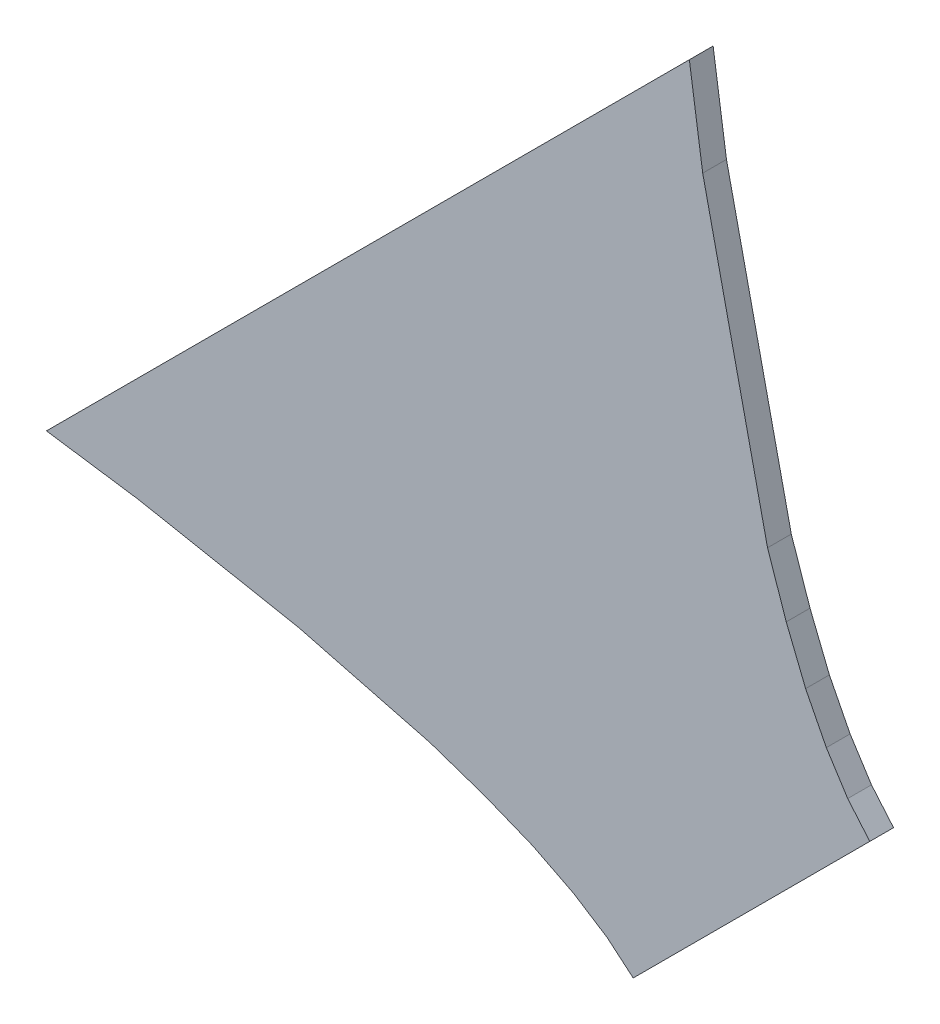
ISO-10303-21;
HEADER;
FILE_DESCRIPTION(('STEP AP214'),'2;1');
FILE_NAME('part.step','',(''),(''),'','','');
FILE_SCHEMA(('AUTOMOTIVE_DESIGN { 1 0 10303 214 1 1 1 1 }'));
ENDSEC;
DATA;
#1=APPLICATION_CONTEXT('core data for automotive mechanical design processes');
#2=APPLICATION_PROTOCOL_DEFINITION('international standard','automotive_design',2000,#1);
#3=PRODUCT_CONTEXT('',#1,'mechanical');
#4=PRODUCT('Part','Part','',(#3));
#5=PRODUCT_RELATED_PRODUCT_CATEGORY('part','',(#4));
#6=PRODUCT_DEFINITION_FORMATION('','',#4);
#7=PRODUCT_DEFINITION_CONTEXT('part definition',#1,'design');
#8=PRODUCT_DEFINITION('design','',#6,#7);
#9=PRODUCT_DEFINITION_SHAPE('','',#8);
#10=(LENGTH_UNIT() NAMED_UNIT(*) SI_UNIT(.MILLI.,.METRE.));
#11=(NAMED_UNIT(*) PLANE_ANGLE_UNIT() SI_UNIT($,.RADIAN.));
#12=(NAMED_UNIT(*) SI_UNIT($,.STERADIAN.) SOLID_ANGLE_UNIT());
#13=UNCERTAINTY_MEASURE_WITH_UNIT(LENGTH_MEASURE(1.E-05),#10,'distance_accuracy_value','');
#14=(GEOMETRIC_REPRESENTATION_CONTEXT(3) GLOBAL_UNCERTAINTY_ASSIGNED_CONTEXT((#13)) GLOBAL_UNIT_ASSIGNED_CONTEXT((#10,
#11,#12)) REPRESENTATION_CONTEXT('',''));
#15=CARTESIAN_POINT('',(0.,0.,0.));
#16=DIRECTION('',(0.,0.,1.));
#17=DIRECTION('',(1.,0.,0.));
#18=AXIS2_PLACEMENT_3D('',#15,#16,#17);
#19=CARTESIAN_POINT('',(75.5120010375977,89.8219985961914,0.));
#20=DIRECTION('',(-0.763352299873124,-0.645982404000613,0.));
#21=DIRECTION('',(-0.645982404000613,0.763352299873124,0.));
#22=AXIS2_PLACEMENT_3D('',#19,#20,#21);
#23=PLANE('',#22);
#24=DIRECTION('',(-0.645982404000613,0.763352299873124,0.));
#25=VECTOR('',#24,1.);
#26=CARTESIAN_POINT('',(75.5120010375977,89.8219985961914,0.03556));
#27=LINE('',#26,#25);
#28=CARTESIAN_POINT('',(75.5120010375977,89.8219985961914,0.03556));
#29=VERTEX_POINT('',#28);
#30=CARTESIAN_POINT('',(75.4789962768555,89.8610000610352,0.03556));
#31=VERTEX_POINT('',#30);
#32=EDGE_CURVE('E11',#29,#31,#27,.T.);
#33=ORIENTED_EDGE('',*,*,#32,.F.);
#34=DIRECTION('',(0.,0.,1.));
#35=VECTOR('',#34,1.);
#36=CARTESIAN_POINT('',(75.5120010375977,89.8219985961914,0.));
#37=LINE('',#36,#35);
#38=CARTESIAN_POINT('',(75.5120010375977,89.8219985961914,0.));
#39=VERTEX_POINT('',#38);
#40=EDGE_CURVE('E24',#39,#29,#37,.T.);
#41=ORIENTED_EDGE('',*,*,#40,.F.);
#42=DIRECTION('',(-0.645982404000613,0.763352299873124,0.));
#43=VECTOR('',#42,1.);
#44=CARTESIAN_POINT('',(75.5120010375977,89.8219985961914,0.));
#45=LINE('',#44,#43);
#46=CARTESIAN_POINT('',(75.4789962768555,89.8610000610352,0.));
#47=VERTEX_POINT('',#46);
#48=EDGE_CURVE('E154',#39,#47,#45,.T.);
#49=ORIENTED_EDGE('',*,*,#48,.T.);
#50=DIRECTION('',(0.,0.,1.));
#51=VECTOR('',#50,1.);
#52=CARTESIAN_POINT('',(75.4789962768555,89.8610000610352,0.));
#53=LINE('',#52,#51);
#54=EDGE_CURVE('E37',#47,#31,#53,.T.);
#55=ORIENTED_EDGE('',*,*,#54,.T.);
#56=EDGE_LOOP('',(#33,#41,#49,#55));
#57=FACE_BOUND('',#56,.T.);
#58=ADVANCED_FACE('F17',(#57),#23,.F.);
#59=CARTESIAN_POINT('',(75.4789962768555,89.8610000610352,0.));
#60=DIRECTION('',(-0.842304075541954,-0.539002638514335,0.));
#61=DIRECTION('',(-0.539002638514335,0.842304075541954,0.));
#62=AXIS2_PLACEMENT_3D('',#59,#60,#61);
#63=PLANE('',#62);
#64=DIRECTION('',(-0.539002638514335,0.842304075541954,0.));
#65=VECTOR('',#64,1.);
#66=CARTESIAN_POINT('',(75.4789962768555,89.8610000610352,0.03556));
#67=LINE('',#66,#65);
#68=CARTESIAN_POINT('',(75.4469985961914,89.911003112793,0.03556));
#69=VERTEX_POINT('',#68);
#70=EDGE_CURVE('E266',#31,#69,#67,.T.);
#71=ORIENTED_EDGE('',*,*,#70,.F.);
#72=ORIENTED_EDGE('',*,*,#54,.F.);
#73=DIRECTION('',(-0.539002638514335,0.842304075541954,0.));
#74=VECTOR('',#73,1.);
#75=CARTESIAN_POINT('',(75.4789962768555,89.8610000610352,0.));
#76=LINE('',#75,#74);
#77=CARTESIAN_POINT('',(75.4469985961914,89.911003112793,0.));
#78=VERTEX_POINT('',#77);
#79=EDGE_CURVE('E263',#47,#78,#76,.T.);
#80=ORIENTED_EDGE('',*,*,#79,.T.);
#81=DIRECTION('',(0.,0.,1.));
#82=VECTOR('',#81,1.);
#83=CARTESIAN_POINT('',(75.4469985961914,89.911003112793,0.));
#84=LINE('',#83,#82);
#85=EDGE_CURVE('E261',#78,#69,#84,.T.);
#86=ORIENTED_EDGE('',*,*,#85,.T.);
#87=EDGE_LOOP('',(#71,#72,#80,#86));
#88=FACE_BOUND('',#87,.T.);
#89=ADVANCED_FACE('F274',(#88),#63,.F.);
#90=CARTESIAN_POINT('',(75.4469985961914,89.911003112793,0.));
#91=DIRECTION('',(-0.891486661595891,-0.453046942597137,0.));
#92=DIRECTION('',(-0.453046942597137,0.891486661595891,0.));
#93=AXIS2_PLACEMENT_3D('',#90,#91,#92);
#94=PLANE('',#93);
#95=DIRECTION('',(-0.453046942597137,0.891486661595891,0.));
#96=VECTOR('',#95,1.);
#97=CARTESIAN_POINT('',(75.4469985961914,89.911003112793,0.03556));
#98=LINE('',#97,#96);
#99=CARTESIAN_POINT('',(75.4160003662109,89.9720001220703,0.03556));
#100=VERTEX_POINT('',#99);
#101=EDGE_CURVE('E258',#69,#100,#98,.T.);
#102=ORIENTED_EDGE('',*,*,#101,.F.);
#103=ORIENTED_EDGE('',*,*,#85,.F.);
#104=DIRECTION('',(-0.453046942597137,0.891486661595891,0.));
#105=VECTOR('',#104,1.);
#106=CARTESIAN_POINT('',(75.4469985961914,89.911003112793,0.));
#107=LINE('',#106,#105);
#108=CARTESIAN_POINT('',(75.4160003662109,89.9720001220703,0.));
#109=VERTEX_POINT('',#108);
#110=EDGE_CURVE('E255',#78,#109,#107,.T.);
#111=ORIENTED_EDGE('',*,*,#110,.T.);
#112=DIRECTION('',(0.,0.,1.));
#113=VECTOR('',#112,1.);
#114=CARTESIAN_POINT('',(75.4160003662109,89.9720001220703,0.));
#115=LINE('',#114,#113);
#116=EDGE_CURVE('E253',#109,#100,#115,.T.);
#117=ORIENTED_EDGE('',*,*,#116,.T.);
#118=EDGE_LOOP('',(#102,#103,#111,#117));
#119=FACE_BOUND('',#118,.T.);
#120=ADVANCED_FACE('F280',(#119),#94,.F.);
#121=CARTESIAN_POINT('',(75.4160003662109,89.9720001220703,0.));
#122=DIRECTION('',(-0.927586015125425,-0.373609668696804,0.));
#123=DIRECTION('',(-0.373609668696804,0.927586015125425,0.));
#124=AXIS2_PLACEMENT_3D('',#121,#122,#123);
#125=PLANE('',#124);
#126=DIRECTION('',(-0.373609668696804,0.927586015125425,0.));
#127=VECTOR('',#126,1.);
#128=CARTESIAN_POINT('',(75.4160003662109,89.9720001220703,0.03556));
#129=LINE('',#128,#127);
#130=CARTESIAN_POINT('',(75.3870010375977,90.0439987182617,0.03556));
#131=VERTEX_POINT('',#130);
#132=EDGE_CURVE('E250',#100,#131,#129,.T.);
#133=ORIENTED_EDGE('',*,*,#132,.F.);
#134=ORIENTED_EDGE('',*,*,#116,.F.);
#135=DIRECTION('',(-0.373609668696804,0.927586015125425,0.));
#136=VECTOR('',#135,1.);
#137=CARTESIAN_POINT('',(75.4160003662109,89.9720001220703,0.));
#138=LINE('',#137,#136);
#139=CARTESIAN_POINT('',(75.3870010375977,90.0439987182617,0.));
#140=VERTEX_POINT('',#139);
#141=EDGE_CURVE('E247',#109,#140,#138,.T.);
#142=ORIENTED_EDGE('',*,*,#141,.T.);
#143=DIRECTION('',(0.,0.,1.));
#144=VECTOR('',#143,1.);
#145=CARTESIAN_POINT('',(75.3870010375977,90.0439987182617,0.));
#146=LINE('',#145,#144);
#147=EDGE_CURVE('E245',#140,#131,#146,.T.);
#148=ORIENTED_EDGE('',*,*,#147,.T.);
#149=EDGE_LOOP('',(#133,#134,#142,#148));
#150=FACE_BOUND('',#149,.T.);
#151=ADVANCED_FACE('F282',(#150),#125,.F.);
#152=CARTESIAN_POINT('',(75.3870010375977,90.0439987182617,0.));
#153=DIRECTION('',(-0.946351169524934,-0.323140006713482,0.));
#154=DIRECTION('',(-0.323140006713482,0.946351169524934,0.));
#155=AXIS2_PLACEMENT_3D('',#152,#153,#154);
#156=PLANE('',#155);
#157=DIRECTION('',(-0.323140006713482,0.946351169524934,0.));
#158=VECTOR('',#157,1.);
#159=CARTESIAN_POINT('',(75.3870010375977,90.0439987182617,0.03556));
#160=LINE('',#159,#158);
#161=CARTESIAN_POINT('',(75.359001159668,90.1259994506836,0.03556));
#162=VERTEX_POINT('',#161);
#163=EDGE_CURVE('E242',#131,#162,#160,.T.);
#164=ORIENTED_EDGE('',*,*,#163,.F.);
#165=ORIENTED_EDGE('',*,*,#147,.F.);
#166=DIRECTION('',(-0.323140006713482,0.946351169524934,0.));
#167=VECTOR('',#166,1.);
#168=CARTESIAN_POINT('',(75.3870010375977,90.0439987182617,0.));
#169=LINE('',#168,#167);
#170=CARTESIAN_POINT('',(75.359001159668,90.1259994506836,0.));
#171=VERTEX_POINT('',#170);
#172=EDGE_CURVE('E239',#140,#171,#169,.T.);
#173=ORIENTED_EDGE('',*,*,#172,.T.);
#174=DIRECTION('',(0.,0.,1.));
#175=VECTOR('',#174,1.);
#176=CARTESIAN_POINT('',(75.359001159668,90.1259994506836,0.));
#177=LINE('',#176,#175);
#178=EDGE_CURVE('E237',#171,#162,#177,.T.);
#179=ORIENTED_EDGE('',*,*,#178,.T.);
#180=EDGE_LOOP('',(#164,#165,#173,#179));
#181=FACE_BOUND('',#180,.T.);
#182=ADVANCED_FACE('F287',(#181),#156,.F.);
#183=CARTESIAN_POINT('',(75.359001159668,90.1259994506836,0.));
#184=DIRECTION('',(-0.976239966514921,-0.216692242082975,0.));
#185=DIRECTION('',(-0.216692242082975,0.976239966514921,0.));
#186=AXIS2_PLACEMENT_3D('',#183,#184,#185);
#187=PLANE('',#186);
#188=DIRECTION('',(-0.216692242082975,0.976239966514921,0.));
#189=VECTOR('',#188,1.);
#190=CARTESIAN_POINT('',(75.359001159668,90.1259994506836,0.03556));
#191=LINE('',#190,#189);
#192=CARTESIAN_POINT('',(75.2620010375977,90.5630035400391,0.03556));
#193=VERTEX_POINT('',#192);
#194=EDGE_CURVE('E234',#162,#193,#191,.T.);
#195=ORIENTED_EDGE('',*,*,#194,.F.);
#196=ORIENTED_EDGE('',*,*,#178,.F.);
#197=DIRECTION('',(-0.216692242082975,0.976239966514921,0.));
#198=VECTOR('',#197,1.);
#199=CARTESIAN_POINT('',(75.359001159668,90.1259994506836,0.));
#200=LINE('',#199,#198);
#201=CARTESIAN_POINT('',(75.2620010375977,90.5630035400391,0.));
#202=VERTEX_POINT('',#201);
#203=EDGE_CURVE('E231',#171,#202,#200,.T.);
#204=ORIENTED_EDGE('',*,*,#203,.T.);
#205=DIRECTION('',(0.,0.,1.));
#206=VECTOR('',#205,1.);
#207=CARTESIAN_POINT('',(75.2620010375977,90.5630035400391,0.));
#208=LINE('',#207,#206);
#209=EDGE_CURVE('E229',#202,#193,#208,.T.);
#210=ORIENTED_EDGE('',*,*,#209,.T.);
#211=EDGE_LOOP('',(#195,#196,#204,#210));
#212=FACE_BOUND('',#211,.T.);
#213=ADVANCED_FACE('F290',(#212),#187,.F.);
#214=CARTESIAN_POINT('',(75.2620010375977,90.5630035400391,0.));
#215=DIRECTION('',(-0.989506077725611,-0.144491252828946,0.));
#216=DIRECTION('',(-0.144491252828946,0.989506077725611,0.));
#217=AXIS2_PLACEMENT_3D('',#214,#215,#216);
#218=PLANE('',#217);
#219=DIRECTION('',(-0.144491252828946,0.989506077725611,0.));
#220=VECTOR('',#219,1.);
#221=CARTESIAN_POINT('',(75.2620010375977,90.5630035400391,0.03556));
#222=LINE('',#221,#220);
#223=CARTESIAN_POINT('',(75.2419967651367,90.6999969482422,0.03556));
#224=VERTEX_POINT('',#223);
#225=EDGE_CURVE('E226',#193,#224,#222,.T.);
#226=ORIENTED_EDGE('',*,*,#225,.F.);
#227=ORIENTED_EDGE('',*,*,#209,.F.);
#228=DIRECTION('',(-0.144491252828946,0.989506077725611,0.));
#229=VECTOR('',#228,1.);
#230=CARTESIAN_POINT('',(75.2620010375977,90.5630035400391,0.));
#231=LINE('',#230,#229);
#232=CARTESIAN_POINT('',(75.2419967651367,90.6999969482422,0.));
#233=VERTEX_POINT('',#232);
#234=EDGE_CURVE('E223',#202,#233,#231,.T.);
#235=ORIENTED_EDGE('',*,*,#234,.T.);
#236=DIRECTION('',(0.,0.,1.));
#237=VECTOR('',#236,1.);
#238=CARTESIAN_POINT('',(75.2419967651367,90.6999969482422,0.));
#239=LINE('',#238,#237);
#240=EDGE_CURVE('E221',#233,#224,#239,.T.);
#241=ORIENTED_EDGE('',*,*,#240,.T.);
#242=EDGE_LOOP('',(#226,#227,#235,#241));
#243=FACE_BOUND('',#242,.T.);
#244=ADVANCED_FACE('F295',(#243),#218,.F.);
#245=CARTESIAN_POINT('',(75.2419967651367,90.6999969482422,0.));
#246=DIRECTION('',(0.707106781186548,-0.707106781186548,0.));
#247=DIRECTION('',(-0.707106781186548,-0.707106781186548,0.));
#248=AXIS2_PLACEMENT_3D('',#245,#246,#247);
#249=PLANE('',#248);
#250=DIRECTION('',(-0.707106781186548,-0.707106781186548,0.));
#251=VECTOR('',#250,1.);
#252=CARTESIAN_POINT('',(75.2419967651367,90.6999969482422,0.03556));
#253=LINE('',#252,#251);
#254=CARTESIAN_POINT('',(74.2799987792969,89.7379989624023,0.03556));
#255=VERTEX_POINT('',#254);
#256=EDGE_CURVE('E218',#224,#255,#253,.T.);
#257=ORIENTED_EDGE('',*,*,#256,.F.);
#258=ORIENTED_EDGE('',*,*,#240,.F.);
#259=DIRECTION('',(-0.707106781186548,-0.707106781186548,0.));
#260=VECTOR('',#259,1.);
#261=CARTESIAN_POINT('',(75.2419967651367,90.6999969482422,0.));
#262=LINE('',#261,#260);
#263=CARTESIAN_POINT('',(74.2799987792969,89.7379989624023,0.));
#264=VERTEX_POINT('',#263);
#265=EDGE_CURVE('E215',#233,#264,#262,.T.);
#266=ORIENTED_EDGE('',*,*,#265,.T.);
#267=DIRECTION('',(0.,0.,1.));
#268=VECTOR('',#267,1.);
#269=CARTESIAN_POINT('',(74.2799987792969,89.7379989624023,0.));
#270=LINE('',#269,#268);
#271=EDGE_CURVE('E213',#264,#255,#270,.T.);
#272=ORIENTED_EDGE('',*,*,#271,.T.);
#273=EDGE_LOOP('',(#257,#258,#266,#272));
#274=FACE_BOUND('',#273,.T.);
#275=ADVANCED_FACE('F298',(#274),#249,.F.);
#276=CARTESIAN_POINT('',(74.2799987792969,89.7379989624024,0.));
#277=DIRECTION('',(0.144429419714034,0.989515104847353,0.));
#278=DIRECTION('',(0.989515104847353,-0.144429419714034,0.));
#279=AXIS2_PLACEMENT_3D('',#276,#277,#278);
#280=PLANE('',#279);
#281=DIRECTION('',(0.989515104847353,-0.144429419714034,0.));
#282=VECTOR('',#281,1.);
#283=CARTESIAN_POINT('',(74.2799987792969,89.7379989624023,0.03556));
#284=LINE('',#283,#282);
#285=CARTESIAN_POINT('',(74.4169998168945,89.7180023193359,0.03556));
#286=VERTEX_POINT('',#285);
#287=EDGE_CURVE('E210',#255,#286,#284,.T.);
#288=ORIENTED_EDGE('',*,*,#287,.F.);
#289=ORIENTED_EDGE('',*,*,#271,.F.);
#290=DIRECTION('',(0.989515104847353,-0.144429419714034,0.));
#291=VECTOR('',#290,1.);
#292=CARTESIAN_POINT('',(74.2799987792969,89.7379989624023,0.));
#293=LINE('',#292,#291);
#294=CARTESIAN_POINT('',(74.4169998168945,89.7180023193359,0.));
#295=VERTEX_POINT('',#294);
#296=EDGE_CURVE('E207',#264,#295,#293,.T.);
#297=ORIENTED_EDGE('',*,*,#296,.T.);
#298=DIRECTION('',(0.,0.,1.));
#299=VECTOR('',#298,1.);
#300=CARTESIAN_POINT('',(74.4169998168945,89.7180023193359,0.));
#301=LINE('',#300,#299);
#302=EDGE_CURVE('E205',#295,#286,#301,.T.);
#303=ORIENTED_EDGE('',*,*,#302,.T.);
#304=EDGE_LOOP('',(#288,#289,#297,#303));
#305=FACE_BOUND('',#304,.T.);
#306=ADVANCED_FACE('F303',(#305),#280,.F.);
#307=CARTESIAN_POINT('',(74.4169998168945,89.7180023193359,0.));
#308=DIRECTION('',(0.188262578969288,0.982118730785557,0.));
#309=DIRECTION('',(0.982118730785557,-0.188262578969288,0.));
#310=AXIS2_PLACEMENT_3D('',#307,#308,#309);
#311=PLANE('',#310);
#312=DIRECTION('',(0.982118730785557,-0.188262578969288,0.));
#313=VECTOR('',#312,1.);
#314=CARTESIAN_POINT('',(74.4169998168945,89.7180023193359,0.03556));
#315=LINE('',#314,#313);
#316=CARTESIAN_POINT('',(74.6569976806641,89.6719970703125,0.03556));
#317=VERTEX_POINT('',#316);
#318=EDGE_CURVE('E202',#286,#317,#315,.T.);
#319=ORIENTED_EDGE('',*,*,#318,.F.);
#320=ORIENTED_EDGE('',*,*,#302,.F.);
#321=DIRECTION('',(0.982118730785557,-0.188262578969288,0.));
#322=VECTOR('',#321,1.);
#323=CARTESIAN_POINT('',(74.4169998168945,89.7180023193359,0.));
#324=LINE('',#323,#322);
#325=CARTESIAN_POINT('',(74.6569976806641,89.6719970703125,0.));
#326=VERTEX_POINT('',#325);
#327=EDGE_CURVE('E199',#295,#326,#324,.T.);
#328=ORIENTED_EDGE('',*,*,#327,.T.);
#329=DIRECTION('',(0.,0.,1.));
#330=VECTOR('',#329,1.);
#331=CARTESIAN_POINT('',(74.6569976806641,89.6719970703125,0.));
#332=LINE('',#331,#330);
#333=EDGE_CURVE('E197',#326,#317,#332,.T.);
#334=ORIENTED_EDGE('',*,*,#333,.T.);
#335=EDGE_LOOP('',(#319,#320,#328,#334));
#336=FACE_BOUND('',#335,.T.);
#337=ADVANCED_FACE('F306',(#336),#311,.F.);
#338=CARTESIAN_POINT('',(74.6569976806641,89.6719970703125,0.));
#339=DIRECTION('',(0.250599120367629,0.968090946590748,0.));
#340=DIRECTION('',(0.968090946590748,-0.250599120367629,0.));
#341=AXIS2_PLACEMENT_3D('',#338,#339,#340);
#342=PLANE('',#341);
#343=DIRECTION('',(0.968090946590748,-0.250599120367629,0.));
#344=VECTOR('',#343,1.);
#345=CARTESIAN_POINT('',(74.6569976806641,89.6719970703125,0.03556));
#346=LINE('',#345,#344);
#347=CARTESIAN_POINT('',(74.8539962768555,89.6210021972656,0.03556));
#348=VERTEX_POINT('',#347);
#349=EDGE_CURVE('E194',#317,#348,#346,.T.);
#350=ORIENTED_EDGE('',*,*,#349,.F.);
#351=ORIENTED_EDGE('',*,*,#333,.F.);
#352=DIRECTION('',(0.968090946590748,-0.250599120367629,0.));
#353=VECTOR('',#352,1.);
#354=CARTESIAN_POINT('',(74.6569976806641,89.6719970703125,0.));
#355=LINE('',#354,#353);
#356=CARTESIAN_POINT('',(74.8539962768555,89.6210021972656,0.));
#357=VERTEX_POINT('',#356);
#358=EDGE_CURVE('E191',#326,#357,#355,.T.);
#359=ORIENTED_EDGE('',*,*,#358,.T.);
#360=DIRECTION('',(0.,0.,1.));
#361=VECTOR('',#360,1.);
#362=CARTESIAN_POINT('',(74.8539962768555,89.6210021972656,0.));
#363=LINE('',#362,#361);
#364=EDGE_CURVE('E189',#357,#348,#363,.T.);
#365=ORIENTED_EDGE('',*,*,#364,.T.);
#366=EDGE_LOOP('',(#350,#351,#359,#365));
#367=FACE_BOUND('',#366,.T.);
#368=ADVANCED_FACE('F311',(#367),#342,.F.);
#369=CARTESIAN_POINT('',(74.8539962768555,89.6210021972656,0.));
#370=DIRECTION('',(0.323140006713482,0.946351169524934,0.));
#371=DIRECTION('',(0.946351169524934,-0.323140006713482,0.));
#372=AXIS2_PLACEMENT_3D('',#369,#370,#371);
#373=PLANE('',#372);
#374=DIRECTION('',(0.946351169524934,-0.323140006713482,0.));
#375=VECTOR('',#374,1.);
#376=CARTESIAN_POINT('',(74.8539962768555,89.6210021972656,0.03556));
#377=LINE('',#376,#375);
#378=CARTESIAN_POINT('',(74.9359970092774,89.5930023193359,0.03556));
#379=VERTEX_POINT('',#378);
#380=EDGE_CURVE('E186',#348,#379,#377,.T.);
#381=ORIENTED_EDGE('',*,*,#380,.F.);
#382=ORIENTED_EDGE('',*,*,#364,.F.);
#383=DIRECTION('',(0.946351169524934,-0.323140006713482,0.));
#384=VECTOR('',#383,1.);
#385=CARTESIAN_POINT('',(74.8539962768555,89.6210021972656,0.));
#386=LINE('',#385,#384);
#387=CARTESIAN_POINT('',(74.9359970092774,89.5930023193359,0.));
#388=VERTEX_POINT('',#387);
#389=EDGE_CURVE('E183',#357,#388,#386,.T.);
#390=ORIENTED_EDGE('',*,*,#389,.T.);
#391=DIRECTION('',(0.,0.,1.));
#392=VECTOR('',#391,1.);
#393=CARTESIAN_POINT('',(74.9359970092774,89.5930023193359,0.));
#394=LINE('',#393,#392);
#395=EDGE_CURVE('E181',#388,#379,#394,.T.);
#396=ORIENTED_EDGE('',*,*,#395,.T.);
#397=EDGE_LOOP('',(#381,#382,#390,#396));
#398=FACE_BOUND('',#397,.T.);
#399=ADVANCED_FACE('F314',(#398),#373,.F.);
#400=CARTESIAN_POINT('',(74.9359970092774,89.5930023193359,0.));
#401=DIRECTION('',(0.373575607794169,0.92759973332317,0.));
#402=DIRECTION('',(0.92759973332317,-0.373575607794169,0.));
#403=AXIS2_PLACEMENT_3D('',#400,#401,#402);
#404=PLANE('',#403);
#405=DIRECTION('',(0.92759973332317,-0.373575607794169,0.));
#406=VECTOR('',#405,1.);
#407=CARTESIAN_POINT('',(74.9359970092774,89.5930023193359,0.03556));
#408=LINE('',#407,#406);
#409=CARTESIAN_POINT('',(75.0080032348633,89.5640029907227,0.03556));
#410=VERTEX_POINT('',#409);
#411=EDGE_CURVE('E178',#379,#410,#408,.T.);
#412=ORIENTED_EDGE('',*,*,#411,.F.);
#413=ORIENTED_EDGE('',*,*,#395,.F.);
#414=DIRECTION('',(0.92759973332317,-0.373575607794169,0.));
#415=VECTOR('',#414,1.);
#416=CARTESIAN_POINT('',(74.9359970092774,89.5930023193359,0.));
#417=LINE('',#416,#415);
#418=CARTESIAN_POINT('',(75.0080032348633,89.5640029907227,0.));
#419=VERTEX_POINT('',#418);
#420=EDGE_CURVE('E175',#388,#419,#417,.T.);
#421=ORIENTED_EDGE('',*,*,#420,.T.);
#422=DIRECTION('',(0.,0.,1.));
#423=VECTOR('',#422,1.);
#424=CARTESIAN_POINT('',(75.0080032348633,89.5640029907227,0.));
#425=LINE('',#424,#423);
#426=EDGE_CURVE('E173',#419,#410,#425,.T.);
#427=ORIENTED_EDGE('',*,*,#426,.T.);
#428=EDGE_LOOP('',(#412,#413,#421,#427));
#429=FACE_BOUND('',#428,.T.);
#430=ADVANCED_FACE('F319',(#429),#404,.F.);
#431=CARTESIAN_POINT('',(75.0080032348633,89.5640029907227,0.));
#432=DIRECTION('',(0.453135554726056,0.891441624024316,0.));
#433=DIRECTION('',(0.891441624024316,-0.453135554726056,0.));
#434=AXIS2_PLACEMENT_3D('',#431,#432,#433);
#435=PLANE('',#434);
#436=DIRECTION('',(0.891441624024316,-0.453135554726056,0.));
#437=VECTOR('',#436,1.);
#438=CARTESIAN_POINT('',(75.0080032348633,89.5640029907227,0.03556));
#439=LINE('',#438,#437);
#440=CARTESIAN_POINT('',(75.0690002441406,89.5329971313477,0.03556));
#441=VERTEX_POINT('',#440);
#442=EDGE_CURVE('E170',#410,#441,#439,.T.);
#443=ORIENTED_EDGE('',*,*,#442,.F.);
#444=ORIENTED_EDGE('',*,*,#426,.F.);
#445=DIRECTION('',(0.891441624024316,-0.453135554726056,0.));
#446=VECTOR('',#445,1.);
#447=CARTESIAN_POINT('',(75.0080032348633,89.5640029907227,0.));
#448=LINE('',#447,#446);
#449=CARTESIAN_POINT('',(75.0690002441406,89.5329971313477,0.));
#450=VERTEX_POINT('',#449);
#451=EDGE_CURVE('E167',#419,#450,#448,.T.);
#452=ORIENTED_EDGE('',*,*,#451,.T.);
#453=DIRECTION('',(0.,0.,1.));
#454=VECTOR('',#453,1.);
#455=CARTESIAN_POINT('',(75.0690002441406,89.5329971313477,0.));
#456=LINE('',#455,#454);
#457=EDGE_CURVE('E165',#450,#441,#456,.T.);
#458=ORIENTED_EDGE('',*,*,#457,.T.);
#459=EDGE_LOOP('',(#443,#444,#452,#458));
#460=FACE_BOUND('',#459,.T.);
#461=ADVANCED_FACE('F322',(#460),#435,.F.);
#462=CARTESIAN_POINT('',(75.0690002441406,89.5329971313477,0.));
#463=DIRECTION('',(0.539002638514335,0.842304075541954,0.));
#464=DIRECTION('',(0.842304075541954,-0.539002638514335,0.));
#465=AXIS2_PLACEMENT_3D('',#462,#463,#464);
#466=PLANE('',#465);
#467=DIRECTION('',(0.842304075541954,-0.539002638514335,0.));
#468=VECTOR('',#467,1.);
#469=CARTESIAN_POINT('',(75.0690002441406,89.5329971313477,0.03556));
#470=LINE('',#469,#468);
#471=CARTESIAN_POINT('',(75.1190032958984,89.5009994506836,0.03556));
#472=VERTEX_POINT('',#471);
#473=EDGE_CURVE('E162',#441,#472,#470,.T.);
#474=ORIENTED_EDGE('',*,*,#473,.F.);
#475=ORIENTED_EDGE('',*,*,#457,.F.);
#476=DIRECTION('',(0.842304075541954,-0.539002638514335,0.));
#477=VECTOR('',#476,1.);
#478=CARTESIAN_POINT('',(75.0690002441406,89.5329971313477,0.));
#479=LINE('',#478,#477);
#480=CARTESIAN_POINT('',(75.1190032958984,89.5009994506836,0.));
#481=VERTEX_POINT('',#480);
#482=EDGE_CURVE('E160',#450,#481,#479,.T.);
#483=ORIENTED_EDGE('',*,*,#482,.T.);
#484=DIRECTION('',(0.,0.,1.));
#485=VECTOR('',#484,1.);
#486=CARTESIAN_POINT('',(75.1190032958984,89.5009994506836,0.));
#487=LINE('',#486,#485);
#488=EDGE_CURVE('E145',#481,#472,#487,.T.);
#489=ORIENTED_EDGE('',*,*,#488,.T.);
#490=EDGE_LOOP('',(#474,#475,#483,#489));
#491=FACE_BOUND('',#490,.T.);
#492=ADVANCED_FACE('F325',(#491),#466,.F.);
#493=CARTESIAN_POINT('',(75.1190032958984,89.5009994506836,0.));
#494=DIRECTION('',(0.645969022323735,0.763363623837367,0.));
#495=DIRECTION('',(0.763363623837367,-0.645969022323735,0.));
#496=AXIS2_PLACEMENT_3D('',#493,#494,#495);
#497=PLANE('',#496);
#498=DIRECTION('',(0.763363623837367,-0.645969022323735,0.));
#499=VECTOR('',#498,1.);
#500=CARTESIAN_POINT('',(75.1190032958984,89.5009994506836,0.03556));
#501=LINE('',#500,#499);
#502=CARTESIAN_POINT('',(75.1579971313477,89.4680023193359,0.03556));
#503=VERTEX_POINT('',#502);
#504=EDGE_CURVE('E149',#472,#503,#501,.T.);
#505=ORIENTED_EDGE('',*,*,#504,.F.);
#506=ORIENTED_EDGE('',*,*,#488,.F.);
#507=DIRECTION('',(0.763363623837367,-0.645969022323735,0.));
#508=VECTOR('',#507,1.);
#509=CARTESIAN_POINT('',(75.1190032958984,89.5009994506836,0.));
#510=LINE('',#509,#508);
#511=CARTESIAN_POINT('',(75.1579971313477,89.4680023193359,0.));
#512=VERTEX_POINT('',#511);
#513=EDGE_CURVE('E141',#481,#512,#510,.T.);
#514=ORIENTED_EDGE('',*,*,#513,.T.);
#515=DIRECTION('',(0.,0.,1.));
#516=VECTOR('',#515,1.);
#517=CARTESIAN_POINT('',(75.1579971313477,89.4680023193359,0.));
#518=LINE('',#517,#516);
#519=EDGE_CURVE('E131',#512,#503,#518,.T.);
#520=ORIENTED_EDGE('',*,*,#519,.T.);
#521=EDGE_LOOP('',(#505,#506,#514,#520));
#522=FACE_BOUND('',#521,.T.);
#523=ADVANCED_FACE('F144',(#522),#497,.F.);
#524=CARTESIAN_POINT('',(75.1579971313477,89.4680023193359,0.));
#525=DIRECTION('',(-0.707099161378241,0.707114400912744,0.));
#526=DIRECTION('',(0.707114400912744,0.707099161378241,0.));
#527=AXIS2_PLACEMENT_3D('',#524,#525,#526);
#528=PLANE('',#527);
#529=DIRECTION('',(0.707114400912744,0.707099161378241,0.));
#530=VECTOR('',#529,1.);
#531=CARTESIAN_POINT('',(75.1579971313477,89.4680023193359,0.03556));
#532=LINE('',#531,#530);
#533=EDGE_CURVE('E137',#503,#29,#532,.T.);
#534=ORIENTED_EDGE('',*,*,#533,.F.);
#535=ORIENTED_EDGE('',*,*,#519,.F.);
#536=DIRECTION('',(0.707114400912744,0.707099161378241,0.));
#537=VECTOR('',#536,1.);
#538=CARTESIAN_POINT('',(75.1579971313477,89.4680023193359,0.));
#539=LINE('',#538,#537);
#540=EDGE_CURVE('E135',#512,#39,#539,.T.);
#541=ORIENTED_EDGE('',*,*,#540,.T.);
#542=ORIENTED_EDGE('',*,*,#40,.T.);
#543=EDGE_LOOP('',(#534,#535,#541,#542));
#544=FACE_BOUND('',#543,.T.);
#545=ADVANCED_FACE('F133',(#544),#528,.F.);
#546=CARTESIAN_POINT('',(75.5120010375977,89.8219985961914,0.));
#547=DIRECTION('',(0.,0.,1.));
#548=DIRECTION('',(1.,0.,0.));
#549=AXIS2_PLACEMENT_3D('',#546,#547,#548);
#550=PLANE('',#549);
#551=ORIENTED_EDGE('',*,*,#540,.F.);
#552=ORIENTED_EDGE('',*,*,#513,.F.);
#553=ORIENTED_EDGE('',*,*,#482,.F.);
#554=ORIENTED_EDGE('',*,*,#451,.F.);
#555=ORIENTED_EDGE('',*,*,#420,.F.);
#556=ORIENTED_EDGE('',*,*,#389,.F.);
#557=ORIENTED_EDGE('',*,*,#358,.F.);
#558=ORIENTED_EDGE('',*,*,#327,.F.);
#559=ORIENTED_EDGE('',*,*,#296,.F.);
#560=ORIENTED_EDGE('',*,*,#265,.F.);
#561=ORIENTED_EDGE('',*,*,#234,.F.);
#562=ORIENTED_EDGE('',*,*,#203,.F.);
#563=ORIENTED_EDGE('',*,*,#172,.F.);
#564=ORIENTED_EDGE('',*,*,#141,.F.);
#565=ORIENTED_EDGE('',*,*,#110,.F.);
#566=ORIENTED_EDGE('',*,*,#79,.F.);
#567=ORIENTED_EDGE('',*,*,#48,.F.);
#568=EDGE_LOOP('',(#551,#552,#553,#554,#555,#556,#557,#558,#559,#560,#561,#562,#563,#564,#565,
#566,#567));
#569=FACE_BOUND('',#568,.T.);
#570=ADVANCED_FACE('F152',(#569),#550,.F.);
#571=CARTESIAN_POINT('',(75.5120010375977,89.8219985961914,0.03556));
#572=DIRECTION('',(0.,0.,1.));
#573=DIRECTION('',(1.,0.,0.));
#574=AXIS2_PLACEMENT_3D('',#571,#572,#573);
#575=PLANE('',#574);
#576=ORIENTED_EDGE('',*,*,#32,.T.);
#577=ORIENTED_EDGE('',*,*,#70,.T.);
#578=ORIENTED_EDGE('',*,*,#101,.T.);
#579=ORIENTED_EDGE('',*,*,#132,.T.);
#580=ORIENTED_EDGE('',*,*,#163,.T.);
#581=ORIENTED_EDGE('',*,*,#194,.T.);
#582=ORIENTED_EDGE('',*,*,#225,.T.);
#583=ORIENTED_EDGE('',*,*,#256,.T.);
#584=ORIENTED_EDGE('',*,*,#287,.T.);
#585=ORIENTED_EDGE('',*,*,#318,.T.);
#586=ORIENTED_EDGE('',*,*,#349,.T.);
#587=ORIENTED_EDGE('',*,*,#380,.T.);
#588=ORIENTED_EDGE('',*,*,#411,.T.);
#589=ORIENTED_EDGE('',*,*,#442,.T.);
#590=ORIENTED_EDGE('',*,*,#473,.T.);
#591=ORIENTED_EDGE('',*,*,#504,.T.);
#592=ORIENTED_EDGE('',*,*,#533,.T.);
#593=EDGE_LOOP('',(#576,#577,#578,#579,#580,#581,#582,#583,#584,#585,#586,#587,#588,#589,#590,
#591,#592));
#594=FACE_BOUND('',#593,.T.);
#595=ADVANCED_FACE('F277',(#594),#575,.T.);
#596=CLOSED_SHELL('',(#58,#89,#120,#151,#182,#213,#244,#275,#306,#337,#368,#399,#430,#461,#492,
#523,#545,#570,#595));
#597=MANIFOLD_SOLID_BREP('B1',#596);
#598=ADVANCED_BREP_SHAPE_REPRESENTATION('',(#18,#597),#14);
#599=SHAPE_DEFINITION_REPRESENTATION(#9,#598);
ENDSEC;
END-ISO-10303-21;
